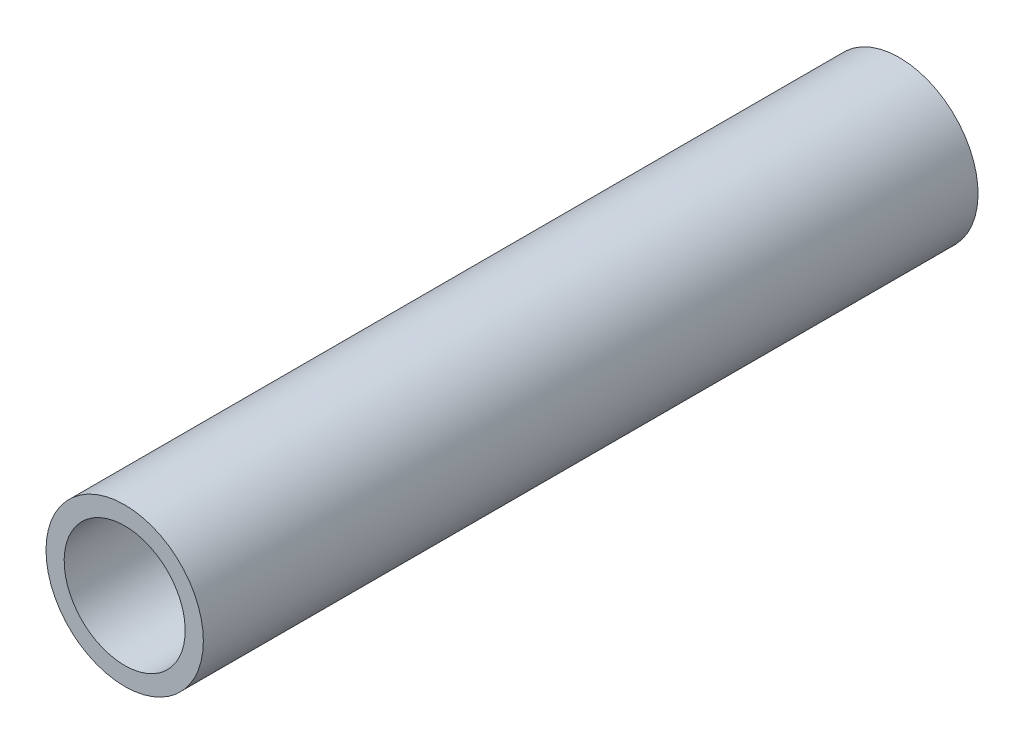
ISO-10303-21;
HEADER;
FILE_DESCRIPTION(('STEP AP214'),'2;1');
FILE_NAME('part.step','',(''),(''),'','','');
FILE_SCHEMA(('AUTOMOTIVE_DESIGN { 1 0 10303 214 1 1 1 1 }'));
ENDSEC;
DATA;
#1=APPLICATION_CONTEXT('core data for automotive mechanical design processes');
#2=APPLICATION_PROTOCOL_DEFINITION('international standard','automotive_design',2000,#1);
#3=PRODUCT_CONTEXT('',#1,'mechanical');
#4=PRODUCT('Part','Part','',(#3));
#5=PRODUCT_RELATED_PRODUCT_CATEGORY('part','',(#4));
#6=PRODUCT_DEFINITION_FORMATION('','',#4);
#7=PRODUCT_DEFINITION_CONTEXT('part definition',#1,'design');
#8=PRODUCT_DEFINITION('design','',#6,#7);
#9=PRODUCT_DEFINITION_SHAPE('','',#8);
#10=(LENGTH_UNIT() NAMED_UNIT(*) SI_UNIT(.MILLI.,.METRE.));
#11=(NAMED_UNIT(*) PLANE_ANGLE_UNIT() SI_UNIT($,.RADIAN.));
#12=(NAMED_UNIT(*) SI_UNIT($,.STERADIAN.) SOLID_ANGLE_UNIT());
#13=UNCERTAINTY_MEASURE_WITH_UNIT(LENGTH_MEASURE(1.E-05),#10,'distance_accuracy_value','');
#14=(GEOMETRIC_REPRESENTATION_CONTEXT(3) GLOBAL_UNCERTAINTY_ASSIGNED_CONTEXT((#13)) GLOBAL_UNIT_ASSIGNED_CONTEXT((#10,
#11,#12)) REPRESENTATION_CONTEXT('',''));
#15=CARTESIAN_POINT('',(0.,0.,0.));
#16=DIRECTION('',(0.,0.,1.));
#17=DIRECTION('',(1.,0.,0.));
#18=AXIS2_PLACEMENT_3D('',#15,#16,#17);
#19=CARTESIAN_POINT('',(12.9650882153969,18.9975389871155,-19.2));
#20=DIRECTION('',(0.,0.,-1.));
#21=DIRECTION('',(-0.872621722111443,0.488396693374617,0.));
#22=AXIS2_PLACEMENT_3D('',#19,#20,#21);
#23=PLANE('',#22);
#24=CARTESIAN_POINT('',(12.9650882153969,18.9975389871155,-19.2));
#25=DIRECTION('',(0.,0.,-1.));
#26=DIRECTION('',(0.,1.,0.));
#27=AXIS2_PLACEMENT_3D('',#24,#25,#26);
#28=CIRCLE('',#27,2.99999999999999);
#29=CARTESIAN_POINT('',(12.9650882153969,21.9975389871155,-19.2));
#30=VERTEX_POINT('',#29);
#31=EDGE_CURVE('E61',#30,#30,#28,.T.);
#32=ORIENTED_EDGE('',*,*,#31,.F.);
#33=EDGE_LOOP('',(#32));
#34=FACE_BOUND('',#33,.T.);
#35=CARTESIAN_POINT('',(12.9650882153969,18.9975389871155,-19.2));
#36=DIRECTION('',(0.,0.,-1.));
#37=DIRECTION('',(0.,1.,0.));
#38=AXIS2_PLACEMENT_3D('',#35,#36,#37);
#39=CIRCLE('',#38,3.9);
#40=CARTESIAN_POINT('',(12.9650882153969,22.8975389871156,-19.2));
#41=VERTEX_POINT('',#40);
#42=EDGE_CURVE('E12',#41,#41,#39,.F.);
#43=ORIENTED_EDGE('',*,*,#42,.F.);
#44=EDGE_LOOP('',(#43));
#45=FACE_BOUND('',#44,.T.);
#46=ADVANCED_FACE('F31',(#34,#45),#23,.T.);
#47=CARTESIAN_POINT('',(12.9650882153969,18.9975389871155,-30.7308657865102));
#48=DIRECTION('',(0.,0.,1.));
#49=DIRECTION('',(1.,0.,0.));
#50=AXIS2_PLACEMENT_3D('',#47,#48,#49);
#51=CYLINDRICAL_SURFACE('',#50,3.9);
#52=ORIENTED_EDGE('',*,*,#42,.T.);
#53=EDGE_LOOP('',(#52));
#54=FACE_BOUND('',#53,.T.);
#55=CARTESIAN_POINT('',(12.9650882153969,18.9975389871155,19.2));
#56=DIRECTION('',(0.,0.,1.));
#57=DIRECTION('',(0.,-1.,0.));
#58=AXIS2_PLACEMENT_3D('',#55,#56,#57);
#59=CIRCLE('',#58,3.9);
#60=CARTESIAN_POINT('',(12.9650882153969,15.0975389871155,19.2));
#61=VERTEX_POINT('',#60);
#62=EDGE_CURVE('E38',#61,#61,#59,.T.);
#63=ORIENTED_EDGE('',*,*,#62,.F.);
#64=EDGE_LOOP('',(#63));
#65=FACE_BOUND('',#64,.T.);
#66=ADVANCED_FACE('F80',(#54,#65),#51,.T.);
#67=CARTESIAN_POINT('',(12.9650882153969,18.9975389871156,19.2));
#68=DIRECTION('',(0.,0.,1.));
#69=DIRECTION('',(0.977149188819429,0.212554611310908,0.));
#70=AXIS2_PLACEMENT_3D('',#67,#68,#69);
#71=PLANE('',#70);
#72=CARTESIAN_POINT('',(12.9650882153969,18.9975389871155,19.2));
#73=DIRECTION('',(0.,0.,1.));
#74=DIRECTION('',(0.,-1.,0.));
#75=AXIS2_PLACEMENT_3D('',#72,#73,#74);
#76=CIRCLE('',#75,2.99999999999999);
#77=CARTESIAN_POINT('',(12.9650882153969,15.9975389871156,19.2));
#78=VERTEX_POINT('',#77);
#79=EDGE_CURVE('E73',#78,#78,#76,.T.);
#80=ORIENTED_EDGE('',*,*,#79,.F.);
#81=EDGE_LOOP('',(#80));
#82=FACE_BOUND('',#81,.T.);
#83=ORIENTED_EDGE('',*,*,#62,.T.);
#84=EDGE_LOOP('',(#83));
#85=FACE_BOUND('',#84,.T.);
#86=ADVANCED_FACE('F78',(#82,#85),#71,.T.);
#87=CARTESIAN_POINT('',(12.9650882153969,18.9975389871155,19.2));
#88=DIRECTION('',(0.,0.,1.));
#89=DIRECTION('',(0.,-1.,0.));
#90=AXIS2_PLACEMENT_3D('',#87,#88,#89);
#91=CYLINDRICAL_SURFACE('',#90,3.);
#92=CARTESIAN_POINT('',(12.9650882153969,18.9975389871155,7.20000000000001));
#93=DIRECTION('',(0.,0.,1.));
#94=DIRECTION('',(0.,-1.,0.));
#95=AXIS2_PLACEMENT_3D('',#92,#93,#94);
#96=CIRCLE('',#95,3.);
#97=CARTESIAN_POINT('',(12.9650882153969,15.9975389871155,7.20000000000001));
#98=VERTEX_POINT('',#97);
#99=EDGE_CURVE('E70',#98,#98,#96,.T.);
#100=ORIENTED_EDGE('',*,*,#99,.F.);
#101=EDGE_LOOP('',(#100));
#102=FACE_BOUND('',#101,.T.);
#103=ORIENTED_EDGE('',*,*,#79,.T.);
#104=EDGE_LOOP('',(#103));
#105=FACE_BOUND('',#104,.T.);
#106=ADVANCED_FACE('F86',(#102,#105),#91,.F.);
#107=CARTESIAN_POINT('',(15.4650882153969,18.9975389871155,7.20000000000001));
#108=DIRECTION('',(0.,0.,-1.));
#109=DIRECTION('',(0.,1.,0.));
#110=AXIS2_PLACEMENT_3D('',#107,#108,#109);
#111=PLANE('',#110);
#112=CARTESIAN_POINT('',(12.9650882153969,18.9975389871155,7.20000000000001));
#113=DIRECTION('',(0.,0.,1.));
#114=DIRECTION('',(0.,-1.,0.));
#115=AXIS2_PLACEMENT_3D('',#112,#113,#114);
#116=CIRCLE('',#115,2.5);
#117=CARTESIAN_POINT('',(12.9650882153969,16.4975389871155,7.20000000000001));
#118=VERTEX_POINT('',#117);
#119=EDGE_CURVE('E67',#118,#118,#116,.T.);
#120=ORIENTED_EDGE('',*,*,#119,.F.);
#121=EDGE_LOOP('',(#120));
#122=FACE_BOUND('',#121,.T.);
#123=ORIENTED_EDGE('',*,*,#99,.T.);
#124=EDGE_LOOP('',(#123));
#125=FACE_BOUND('',#124,.T.);
#126=ADVANCED_FACE('F94',(#122,#125),#111,.F.);
#127=CARTESIAN_POINT('',(12.9650882153969,18.9975389871155,19.2));
#128=DIRECTION('',(0.,0.,1.));
#129=DIRECTION('',(0.,-1.,0.));
#130=AXIS2_PLACEMENT_3D('',#127,#128,#129);
#131=CYLINDRICAL_SURFACE('',#130,2.5);
#132=CARTESIAN_POINT('',(12.9650882153969,18.9975389871155,4.20000000000001));
#133=DIRECTION('',(0.,0.,1.));
#134=DIRECTION('',(0.,-1.,0.));
#135=AXIS2_PLACEMENT_3D('',#132,#133,#134);
#136=CIRCLE('',#135,2.5);
#137=CARTESIAN_POINT('',(12.9650882153969,16.4975389871155,4.20000000000001));
#138=VERTEX_POINT('',#137);
#139=EDGE_CURVE('E64',#138,#138,#136,.T.);
#140=ORIENTED_EDGE('',*,*,#139,.F.);
#141=EDGE_LOOP('',(#140));
#142=FACE_BOUND('',#141,.T.);
#143=ORIENTED_EDGE('',*,*,#119,.T.);
#144=EDGE_LOOP('',(#143));
#145=FACE_BOUND('',#144,.T.);
#146=ADVANCED_FACE('F98',(#142,#145),#131,.F.);
#147=CARTESIAN_POINT('',(12.9650882153969,18.9975389871155,4.20000000000001));
#148=DIRECTION('',(0.,0.,1.));
#149=DIRECTION('',(0.,-1.,0.));
#150=AXIS2_PLACEMENT_3D('',#147,#148,#149);
#151=CONICAL_SURFACE('',#150,2.5,1.02974425867665);
#152=CARTESIAN_POINT('',(12.9650882153969,18.9975389871155,2.69784845243111));
#153=VERTEX_POINT('',#152);
#154=VERTEX_LOOP('',#153);
#155=FACE_BOUND('',#154,.T.);
#156=ORIENTED_EDGE('',*,*,#139,.T.);
#157=EDGE_LOOP('',(#156));
#158=FACE_BOUND('',#157,.T.);
#159=ADVANCED_FACE('F102',(#155,#158),#151,.F.);
#160=CARTESIAN_POINT('',(12.9650882153969,18.9975389871155,-19.2));
#161=DIRECTION('',(0.,0.,-1.));
#162=DIRECTION('',(0.,1.,0.));
#163=AXIS2_PLACEMENT_3D('',#160,#161,#162);
#164=CYLINDRICAL_SURFACE('',#163,3.);
#165=CARTESIAN_POINT('',(12.9650882153969,18.9975389871155,-7.2));
#166=DIRECTION('',(0.,0.,-1.));
#167=DIRECTION('',(0.,1.,0.));
#168=AXIS2_PLACEMENT_3D('',#165,#166,#167);
#169=CIRCLE('',#168,3.);
#170=CARTESIAN_POINT('',(12.9650882153969,21.9975389871155,-7.2));
#171=VERTEX_POINT('',#170);
#172=EDGE_CURVE('E56',#171,#171,#169,.T.);
#173=ORIENTED_EDGE('',*,*,#172,.F.);
#174=EDGE_LOOP('',(#173));
#175=FACE_BOUND('',#174,.T.);
#176=ORIENTED_EDGE('',*,*,#31,.T.);
#177=EDGE_LOOP('',(#176));
#178=FACE_BOUND('',#177,.T.);
#179=ADVANCED_FACE('F106',(#175,#178),#164,.F.);
#180=CARTESIAN_POINT('',(15.4650882153969,18.9975389871155,-7.2));
#181=DIRECTION('',(0.,0.,1.));
#182=DIRECTION('',(0.,-1.,0.));
#183=AXIS2_PLACEMENT_3D('',#180,#181,#182);
#184=PLANE('',#183);
#185=CARTESIAN_POINT('',(12.9650882153969,18.9975389871155,-7.2));
#186=DIRECTION('',(0.,0.,-1.));
#187=DIRECTION('',(0.,1.,0.));
#188=AXIS2_PLACEMENT_3D('',#185,#186,#187);
#189=CIRCLE('',#188,2.5);
#190=CARTESIAN_POINT('',(12.9650882153969,21.4975389871155,-7.2));
#191=VERTEX_POINT('',#190);
#192=EDGE_CURVE('E53',#191,#191,#189,.T.);
#193=ORIENTED_EDGE('',*,*,#192,.F.);
#194=EDGE_LOOP('',(#193));
#195=FACE_BOUND('',#194,.T.);
#196=ORIENTED_EDGE('',*,*,#172,.T.);
#197=EDGE_LOOP('',(#196));
#198=FACE_BOUND('',#197,.T.);
#199=ADVANCED_FACE('F109',(#195,#198),#184,.F.);
#200=CARTESIAN_POINT('',(12.9650882153969,18.9975389871155,-19.2));
#201=DIRECTION('',(0.,0.,-1.));
#202=DIRECTION('',(0.,1.,0.));
#203=AXIS2_PLACEMENT_3D('',#200,#201,#202);
#204=CYLINDRICAL_SURFACE('',#203,2.5);
#205=CARTESIAN_POINT('',(12.9650882153969,18.9975389871155,-4.20000000000001));
#206=DIRECTION('',(0.,0.,-1.));
#207=DIRECTION('',(0.,1.,0.));
#208=AXIS2_PLACEMENT_3D('',#205,#206,#207);
#209=CIRCLE('',#208,2.5);
#210=CARTESIAN_POINT('',(12.9650882153969,21.4975389871155,-4.2));
#211=VERTEX_POINT('',#210);
#212=EDGE_CURVE('E51',#211,#211,#209,.T.);
#213=ORIENTED_EDGE('',*,*,#212,.F.);
#214=EDGE_LOOP('',(#213));
#215=FACE_BOUND('',#214,.T.);
#216=ORIENTED_EDGE('',*,*,#192,.T.);
#217=EDGE_LOOP('',(#216));
#218=FACE_BOUND('',#217,.T.);
#219=ADVANCED_FACE('F47',(#215,#218),#204,.F.);
#220=CARTESIAN_POINT('',(12.9650882153969,18.9975389871155,-4.20000000000001));
#221=DIRECTION('',(0.,0.,-1.));
#222=DIRECTION('',(0.,1.,0.));
#223=AXIS2_PLACEMENT_3D('',#220,#221,#222);
#224=CONICAL_SURFACE('',#223,2.5,1.02974425867665);
#225=CARTESIAN_POINT('',(12.9650882153969,18.9975389871155,-2.69784845243111));
#226=VERTEX_POINT('',#225);
#227=VERTEX_LOOP('',#226);
#228=FACE_BOUND('',#227,.T.);
#229=ORIENTED_EDGE('',*,*,#212,.T.);
#230=EDGE_LOOP('',(#229));
#231=FACE_BOUND('',#230,.T.);
#232=ADVANCED_FACE('F44',(#228,#231),#224,.F.);
#233=CLOSED_SHELL('',(#46,#66,#86,#106,#126,#146,#159,#179,#199,#219,#232));
#234=MANIFOLD_SOLID_BREP('B2',#233);
#235=ADVANCED_BREP_SHAPE_REPRESENTATION('',(#18,#234),#14);
#236=SHAPE_DEFINITION_REPRESENTATION(#9,#235);
ENDSEC;
END-ISO-10303-21;
